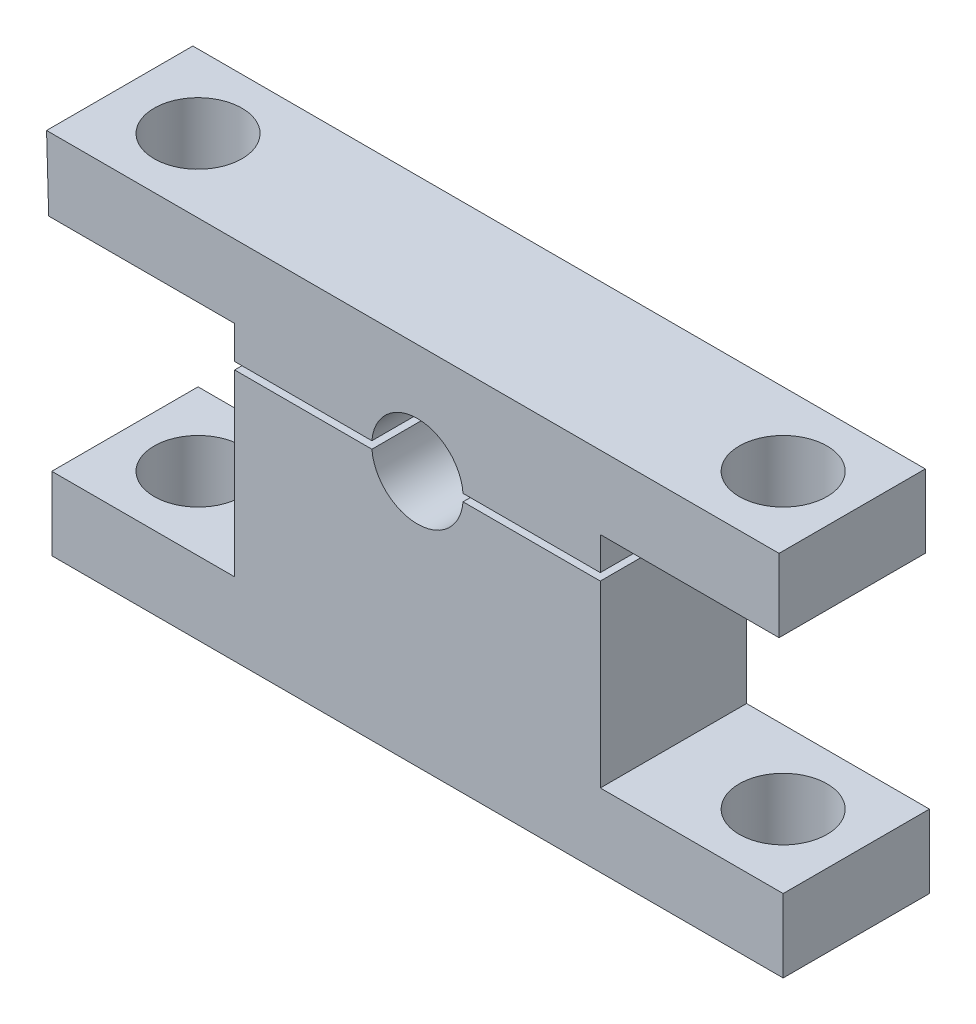
ISO-10303-21;
HEADER;
FILE_DESCRIPTION(('STEP AP214'),'2;1');
FILE_NAME('part.step','',(''),(''),'','','');
FILE_SCHEMA(('AUTOMOTIVE_DESIGN { 1 0 10303 214 1 1 1 1 }'));
ENDSEC;
DATA;
#1=APPLICATION_CONTEXT('core data for automotive mechanical design processes');
#2=APPLICATION_PROTOCOL_DEFINITION('international standard','automotive_design',2000,#1);
#3=PRODUCT_CONTEXT('',#1,'mechanical');
#4=PRODUCT('Part','Part','',(#3));
#5=PRODUCT_RELATED_PRODUCT_CATEGORY('part','',(#4));
#6=PRODUCT_DEFINITION_FORMATION('','',#4);
#7=PRODUCT_DEFINITION_CONTEXT('part definition',#1,'design');
#8=PRODUCT_DEFINITION('design','',#6,#7);
#9=PRODUCT_DEFINITION_SHAPE('','',#8);
#10=(LENGTH_UNIT() NAMED_UNIT(*) SI_UNIT(.MILLI.,.METRE.));
#11=(NAMED_UNIT(*) PLANE_ANGLE_UNIT() SI_UNIT($,.RADIAN.));
#12=(NAMED_UNIT(*) SI_UNIT($,.STERADIAN.) SOLID_ANGLE_UNIT());
#13=UNCERTAINTY_MEASURE_WITH_UNIT(LENGTH_MEASURE(1.E-05),#10,'distance_accuracy_value','');
#14=(GEOMETRIC_REPRESENTATION_CONTEXT(3) GLOBAL_UNCERTAINTY_ASSIGNED_CONTEXT((#13)) GLOBAL_UNIT_ASSIGNED_CONTEXT((#10,
#11,#12)) REPRESENTATION_CONTEXT('',''));
#15=CARTESIAN_POINT('',(0.,0.,0.));
#16=DIRECTION('',(0.,0.,1.));
#17=DIRECTION('',(1.,0.,0.));
#18=AXIS2_PLACEMENT_3D('',#15,#16,#17);
#19=CARTESIAN_POINT('',(-12.7,-3.81,5.08));
#20=DIRECTION('',(0.,1.,0.));
#21=DIRECTION('',(-1.,0.,0.));
#22=AXIS2_PLACEMENT_3D('',#19,#20,#21);
#23=PLANE('',#22);
#24=CARTESIAN_POINT('',(-10.16,-3.81,2.54));
#25=DIRECTION('',(0.,1.,0.));
#26=DIRECTION('',(-1.,0.,0.));
#27=AXIS2_PLACEMENT_3D('',#24,#25,#26);
#28=CIRCLE('',#27,1.524);
#29=CARTESIAN_POINT('',(-10.16,-3.81,4.064));
#30=VERTEX_POINT('',#29);
#31=EDGE_CURVE('E191',#30,#30,#28,.T.);
#32=ORIENTED_EDGE('',*,*,#31,.F.);
#33=EDGE_LOOP('',(#32));
#34=FACE_BOUND('',#33,.T.);
#35=DIRECTION('',(1.,0.,0.));
#36=VECTOR('',#35,1.);
#37=CARTESIAN_POINT('',(-12.7,-3.81,0.));
#38=LINE('',#37,#36);
#39=CARTESIAN_POINT('',(-12.7,-3.81,0.));
#40=VERTEX_POINT('',#39);
#41=CARTESIAN_POINT('',(-6.35,-3.81,0.));
#42=VERTEX_POINT('',#41);
#43=EDGE_CURVE('E12',#40,#42,#38,.T.);
#44=ORIENTED_EDGE('',*,*,#43,.F.);
#45=DIRECTION('',(0.,0.,-1.));
#46=VECTOR('',#45,1.);
#47=CARTESIAN_POINT('',(-12.7,-3.81,5.08));
#48=LINE('',#47,#46);
#49=CARTESIAN_POINT('',(-12.7,-3.81,5.08));
#50=VERTEX_POINT('',#49);
#51=EDGE_CURVE('E111',#50,#40,#48,.T.);
#52=ORIENTED_EDGE('',*,*,#51,.F.);
#53=DIRECTION('',(1.,0.,0.));
#54=VECTOR('',#53,1.);
#55=CARTESIAN_POINT('',(-12.7,-3.81,5.08));
#56=LINE('',#55,#54);
#57=CARTESIAN_POINT('',(-6.35,-3.81,5.08));
#58=VERTEX_POINT('',#57);
#59=EDGE_CURVE('E178',#50,#58,#56,.T.);
#60=ORIENTED_EDGE('',*,*,#59,.T.);
#61=DIRECTION('',(0.,0.,-1.));
#62=VECTOR('',#61,1.);
#63=CARTESIAN_POINT('',(-6.35,-3.81,5.08));
#64=LINE('',#63,#62);
#65=EDGE_CURVE('E104',#58,#42,#64,.T.);
#66=ORIENTED_EDGE('',*,*,#65,.T.);
#67=EDGE_LOOP('',(#44,#52,#60,#66));
#68=FACE_BOUND('',#67,.T.);
#69=ADVANCED_FACE('F51',(#34,#68),#23,.T.);
#70=CARTESIAN_POINT('',(-12.7,-6.35,5.08));
#71=DIRECTION('',(-1.,0.,0.));
#72=DIRECTION('',(0.,0.,1.));
#73=AXIS2_PLACEMENT_3D('',#70,#71,#72);
#74=PLANE('',#73);
#75=DIRECTION('',(0.,1.,0.));
#76=VECTOR('',#75,1.);
#77=CARTESIAN_POINT('',(-12.7,-6.35,0.));
#78=LINE('',#77,#76);
#79=CARTESIAN_POINT('',(-12.7,-6.35,0.));
#80=VERTEX_POINT('',#79);
#81=EDGE_CURVE('E180',#80,#40,#78,.T.);
#82=ORIENTED_EDGE('',*,*,#81,.F.);
#83=DIRECTION('',(0.,0.,-1.));
#84=VECTOR('',#83,1.);
#85=CARTESIAN_POINT('',(-12.7,-6.35,5.08));
#86=LINE('',#85,#84);
#87=CARTESIAN_POINT('',(-12.7,-6.35,5.08));
#88=VERTEX_POINT('',#87);
#89=EDGE_CURVE('E208',#88,#80,#86,.T.);
#90=ORIENTED_EDGE('',*,*,#89,.F.);
#91=DIRECTION('',(0.,1.,0.));
#92=VECTOR('',#91,1.);
#93=CARTESIAN_POINT('',(-12.7,-6.35,5.08));
#94=LINE('',#93,#92);
#95=EDGE_CURVE('E160',#88,#50,#94,.T.);
#96=ORIENTED_EDGE('',*,*,#95,.T.);
#97=ORIENTED_EDGE('',*,*,#51,.T.);
#98=EDGE_LOOP('',(#82,#90,#96,#97));
#99=FACE_BOUND('',#98,.T.);
#100=ADVANCED_FACE('F247',(#99),#74,.T.);
#101=CARTESIAN_POINT('',(-12.7,-6.35,5.08));
#102=DIRECTION('',(0.,1.,0.));
#103=DIRECTION('',(0.,0.,1.));
#104=AXIS2_PLACEMENT_3D('',#101,#102,#103);
#105=PLANE('',#104);
#106=CARTESIAN_POINT('',(-10.16,-6.35,2.54));
#107=DIRECTION('',(0.,1.,0.));
#108=DIRECTION('',(0.,0.,1.));
#109=AXIS2_PLACEMENT_3D('',#106,#107,#108);
#110=CIRCLE('',#109,1.524);
#111=CARTESIAN_POINT('',(-10.16,-6.35,4.064));
#112=VERTEX_POINT('',#111);
#113=EDGE_CURVE('E55',#112,#112,#110,.T.);
#114=ORIENTED_EDGE('',*,*,#113,.T.);
#115=EDGE_LOOP('',(#114));
#116=FACE_BOUND('',#115,.T.);
#117=CARTESIAN_POINT('',(10.16,-6.35,2.54));
#118=DIRECTION('',(0.,1.,0.));
#119=DIRECTION('',(0.,0.,1.));
#120=AXIS2_PLACEMENT_3D('',#117,#118,#119);
#121=CIRCLE('',#120,1.524);
#122=CARTESIAN_POINT('',(10.16,-6.35,4.064));
#123=VERTEX_POINT('',#122);
#124=EDGE_CURVE('E183',#123,#123,#121,.T.);
#125=ORIENTED_EDGE('',*,*,#124,.T.);
#126=EDGE_LOOP('',(#125));
#127=FACE_BOUND('',#126,.T.);
#128=DIRECTION('',(1.,0.,0.));
#129=VECTOR('',#128,1.);
#130=CARTESIAN_POINT('',(-12.7,-6.35,0.));
#131=LINE('',#130,#129);
#132=CARTESIAN_POINT('',(12.7,-6.35,0.));
#133=VERTEX_POINT('',#132);
#134=EDGE_CURVE('E213',#80,#133,#131,.T.);
#135=ORIENTED_EDGE('',*,*,#134,.T.);
#136=DIRECTION('',(0.,0.,-1.));
#137=VECTOR('',#136,1.);
#138=CARTESIAN_POINT('',(12.7,-6.35,5.08));
#139=LINE('',#138,#137);
#140=CARTESIAN_POINT('',(12.7,-6.35,5.08));
#141=VERTEX_POINT('',#140);
#142=EDGE_CURVE('E205',#141,#133,#139,.T.);
#143=ORIENTED_EDGE('',*,*,#142,.F.);
#144=DIRECTION('',(1.,0.,0.));
#145=VECTOR('',#144,1.);
#146=CARTESIAN_POINT('',(-12.7,-6.35,5.08));
#147=LINE('',#146,#145);
#148=EDGE_CURVE('E162',#88,#141,#147,.T.);
#149=ORIENTED_EDGE('',*,*,#148,.F.);
#150=ORIENTED_EDGE('',*,*,#89,.T.);
#151=EDGE_LOOP('',(#135,#143,#149,#150));
#152=FACE_BOUND('',#151,.T.);
#153=ADVANCED_FACE('F245',(#116,#127,#152),#105,.F.);
#154=CARTESIAN_POINT('',(12.7,-6.35,5.08));
#155=DIRECTION('',(-1.,0.,0.));
#156=DIRECTION('',(0.,0.,1.));
#157=AXIS2_PLACEMENT_3D('',#154,#155,#156);
#158=PLANE('',#157);
#159=DIRECTION('',(0.,1.,0.));
#160=VECTOR('',#159,1.);
#161=CARTESIAN_POINT('',(12.7,-6.35,0.));
#162=LINE('',#161,#160);
#163=CARTESIAN_POINT('',(12.7,-3.81,0.));
#164=VERTEX_POINT('',#163);
#165=EDGE_CURVE('E215',#133,#164,#162,.T.);
#166=ORIENTED_EDGE('',*,*,#165,.T.);
#167=DIRECTION('',(0.,0.,-1.));
#168=VECTOR('',#167,1.);
#169=CARTESIAN_POINT('',(12.7,-3.81,5.08));
#170=LINE('',#169,#168);
#171=CARTESIAN_POINT('',(12.7,-3.81,5.08));
#172=VERTEX_POINT('',#171);
#173=EDGE_CURVE('E203',#172,#164,#170,.T.);
#174=ORIENTED_EDGE('',*,*,#173,.F.);
#175=DIRECTION('',(0.,1.,0.));
#176=VECTOR('',#175,1.);
#177=CARTESIAN_POINT('',(12.7,-6.35,5.08));
#178=LINE('',#177,#176);
#179=EDGE_CURVE('E164',#141,#172,#178,.T.);
#180=ORIENTED_EDGE('',*,*,#179,.F.);
#181=ORIENTED_EDGE('',*,*,#142,.T.);
#182=EDGE_LOOP('',(#166,#174,#180,#181));
#183=FACE_BOUND('',#182,.T.);
#184=ADVANCED_FACE('F241',(#183),#158,.F.);
#185=CARTESIAN_POINT('',(6.35,-3.81,5.08));
#186=DIRECTION('',(0.,1.,0.));
#187=DIRECTION('',(-1.,0.,0.));
#188=AXIS2_PLACEMENT_3D('',#185,#186,#187);
#189=PLANE('',#188);
#190=CARTESIAN_POINT('',(10.16,-3.81,2.54));
#191=DIRECTION('',(0.,1.,0.));
#192=DIRECTION('',(-1.,0.,0.));
#193=AXIS2_PLACEMENT_3D('',#190,#191,#192);
#194=CIRCLE('',#193,1.524);
#195=CARTESIAN_POINT('',(10.16,-3.81,4.064));
#196=VERTEX_POINT('',#195);
#197=EDGE_CURVE('E181',#196,#196,#194,.T.);
#198=ORIENTED_EDGE('',*,*,#197,.F.);
#199=EDGE_LOOP('',(#198));
#200=FACE_BOUND('',#199,.T.);
#201=DIRECTION('',(1.,0.,0.));
#202=VECTOR('',#201,1.);
#203=CARTESIAN_POINT('',(6.35,-3.81,0.));
#204=LINE('',#203,#202);
#205=CARTESIAN_POINT('',(6.35,-3.81,0.));
#206=VERTEX_POINT('',#205);
#207=EDGE_CURVE('E218',#206,#164,#204,.T.);
#208=ORIENTED_EDGE('',*,*,#207,.F.);
#209=DIRECTION('',(0.,0.,-1.));
#210=VECTOR('',#209,1.);
#211=CARTESIAN_POINT('',(6.35,-3.81,5.08));
#212=LINE('',#211,#210);
#213=CARTESIAN_POINT('',(6.35,-3.81,5.08));
#214=VERTEX_POINT('',#213);
#215=EDGE_CURVE('E201',#214,#206,#212,.T.);
#216=ORIENTED_EDGE('',*,*,#215,.F.);
#217=DIRECTION('',(1.,0.,0.));
#218=VECTOR('',#217,1.);
#219=CARTESIAN_POINT('',(6.35,-3.81,5.08));
#220=LINE('',#219,#218);
#221=EDGE_CURVE('E166',#214,#172,#220,.T.);
#222=ORIENTED_EDGE('',*,*,#221,.T.);
#223=ORIENTED_EDGE('',*,*,#173,.T.);
#224=EDGE_LOOP('',(#208,#216,#222,#223));
#225=FACE_BOUND('',#224,.T.);
#226=ADVANCED_FACE('F237',(#200,#225),#189,.T.);
#227=CARTESIAN_POINT('',(6.35,-3.81,5.08));
#228=DIRECTION('',(-1.,0.,0.));
#229=DIRECTION('',(0.,-1.,0.));
#230=AXIS2_PLACEMENT_3D('',#227,#228,#229);
#231=PLANE('',#230);
#232=DIRECTION('',(0.,1.,0.));
#233=VECTOR('',#232,1.);
#234=CARTESIAN_POINT('',(6.35,-3.81,0.));
#235=LINE('',#234,#233);
#236=CARTESIAN_POINT('',(6.35,2.413,0.));
#237=VERTEX_POINT('',#236);
#238=EDGE_CURVE('E221',#206,#237,#235,.T.);
#239=ORIENTED_EDGE('',*,*,#238,.T.);
#240=DIRECTION('',(0.,0.,-1.));
#241=VECTOR('',#240,1.);
#242=CARTESIAN_POINT('',(6.35,2.413,5.08));
#243=LINE('',#242,#241);
#244=CARTESIAN_POINT('',(6.35,2.413,5.08));
#245=VERTEX_POINT('',#244);
#246=EDGE_CURVE('E198',#245,#237,#243,.T.);
#247=ORIENTED_EDGE('',*,*,#246,.F.);
#248=DIRECTION('',(0.,-1.,0.));
#249=VECTOR('',#248,1.);
#250=CARTESIAN_POINT('',(6.35,2.413,5.08));
#251=LINE('',#250,#249);
#252=EDGE_CURVE('E169',#245,#214,#251,.T.);
#253=ORIENTED_EDGE('',*,*,#252,.T.);
#254=ORIENTED_EDGE('',*,*,#215,.T.);
#255=EDGE_LOOP('',(#239,#247,#253,#254));
#256=FACE_BOUND('',#255,.T.);
#257=ADVANCED_FACE('F229',(#256),#231,.F.);
#258=CARTESIAN_POINT('',(1.58241184588589,2.413,5.08));
#259=DIRECTION('',(0.,1.,0.));
#260=DIRECTION('',(-1.,0.,0.));
#261=AXIS2_PLACEMENT_3D('',#258,#259,#260);
#262=PLANE('',#261);
#263=DIRECTION('',(1.,0.,0.));
#264=VECTOR('',#263,1.);
#265=CARTESIAN_POINT('',(1.58241184588589,2.413,0.));
#266=LINE('',#265,#264);
#267=CARTESIAN_POINT('',(1.58241184588589,2.413,0.));
#268=VERTEX_POINT('',#267);
#269=EDGE_CURVE('E153',#268,#237,#266,.T.);
#270=ORIENTED_EDGE('',*,*,#269,.F.);
#271=DIRECTION('',(0.,0.,-1.));
#272=VECTOR('',#271,1.);
#273=CARTESIAN_POINT('',(1.58241184588589,2.413,5.08));
#274=LINE('',#273,#272);
#275=CARTESIAN_POINT('',(1.58241184588589,2.413,5.08));
#276=VERTEX_POINT('',#275);
#277=EDGE_CURVE('E145',#276,#268,#274,.T.);
#278=ORIENTED_EDGE('',*,*,#277,.F.);
#279=DIRECTION('',(1.,0.,0.));
#280=VECTOR('',#279,1.);
#281=CARTESIAN_POINT('',(1.58241184588589,2.413,5.08));
#282=LINE('',#281,#280);
#283=EDGE_CURVE('E171',#276,#245,#282,.T.);
#284=ORIENTED_EDGE('',*,*,#283,.T.);
#285=ORIENTED_EDGE('',*,*,#246,.T.);
#286=EDGE_LOOP('',(#270,#278,#284,#285));
#287=FACE_BOUND('',#286,.T.);
#288=ADVANCED_FACE('F225',(#287),#262,.T.);
#289=CARTESIAN_POINT('',(0.,2.54,5.08));
#290=DIRECTION('',(0.,0.,-1.));
#291=DIRECTION('',(-1.,0.,0.));
#292=AXIS2_PLACEMENT_3D('',#289,#290,#291);
#293=CYLINDRICAL_SURFACE('',#292,1.5875);
#294=CARTESIAN_POINT('',(0.,2.54,0.));
#295=DIRECTION('',(0.,0.,1.));
#296=DIRECTION('',(1.,0.,0.));
#297=AXIS2_PLACEMENT_3D('',#294,#295,#296);
#298=CIRCLE('',#297,1.5875);
#299=CARTESIAN_POINT('',(-1.5824118458859,2.413,0.));
#300=VERTEX_POINT('',#299);
#301=EDGE_CURVE('E148',#300,#268,#298,.T.);
#302=ORIENTED_EDGE('',*,*,#301,.F.);
#303=DIRECTION('',(0.,0.,-1.));
#304=VECTOR('',#303,1.);
#305=CARTESIAN_POINT('',(-1.5824118458859,2.413,5.08));
#306=LINE('',#305,#304);
#307=CARTESIAN_POINT('',(-1.5824118458859,2.413,5.08));
#308=VERTEX_POINT('',#307);
#309=EDGE_CURVE('E134',#308,#300,#306,.T.);
#310=ORIENTED_EDGE('',*,*,#309,.F.);
#311=CARTESIAN_POINT('',(0.,2.54,5.08));
#312=DIRECTION('',(0.,0.,1.));
#313=DIRECTION('',(1.,0.,0.));
#314=AXIS2_PLACEMENT_3D('',#311,#312,#313);
#315=CIRCLE('',#314,1.5875);
#316=EDGE_CURVE('E174',#308,#276,#315,.T.);
#317=ORIENTED_EDGE('',*,*,#316,.T.);
#318=ORIENTED_EDGE('',*,*,#277,.T.);
#319=EDGE_LOOP('',(#302,#310,#317,#318));
#320=FACE_BOUND('',#319,.T.);
#321=ADVANCED_FACE('F149',(#320),#293,.F.);
#322=CARTESIAN_POINT('',(-6.35,2.413,5.08));
#323=DIRECTION('',(0.,1.,0.));
#324=DIRECTION('',(0.,0.,1.));
#325=AXIS2_PLACEMENT_3D('',#322,#323,#324);
#326=PLANE('',#325);
#327=DIRECTION('',(1.,0.,0.));
#328=VECTOR('',#327,1.);
#329=CARTESIAN_POINT('',(-6.35,2.413,0.));
#330=LINE('',#329,#328);
#331=CARTESIAN_POINT('',(-6.35,2.413,0.));
#332=VERTEX_POINT('',#331);
#333=EDGE_CURVE('E138',#332,#300,#330,.T.);
#334=ORIENTED_EDGE('',*,*,#333,.F.);
#335=DIRECTION('',(0.,0.,-1.));
#336=VECTOR('',#335,1.);
#337=CARTESIAN_POINT('',(-6.35,2.413,5.08));
#338=LINE('',#337,#336);
#339=CARTESIAN_POINT('',(-6.35,2.413,5.08));
#340=VERTEX_POINT('',#339);
#341=EDGE_CURVE('E144',#340,#332,#338,.T.);
#342=ORIENTED_EDGE('',*,*,#341,.F.);
#343=DIRECTION('',(1.,0.,0.));
#344=VECTOR('',#343,1.);
#345=CARTESIAN_POINT('',(-6.35,2.413,5.08));
#346=LINE('',#345,#344);
#347=EDGE_CURVE('E140',#340,#308,#346,.T.);
#348=ORIENTED_EDGE('',*,*,#347,.T.);
#349=ORIENTED_EDGE('',*,*,#309,.T.);
#350=EDGE_LOOP('',(#334,#342,#348,#349));
#351=FACE_BOUND('',#350,.T.);
#352=ADVANCED_FACE('F136',(#351),#326,.T.);
#353=CARTESIAN_POINT('',(-6.35,2.413,5.08));
#354=DIRECTION('',(1.,0.,0.));
#355=DIRECTION('',(0.,1.,0.));
#356=AXIS2_PLACEMENT_3D('',#353,#354,#355);
#357=PLANE('',#356);
#358=DIRECTION('',(0.,-1.,0.));
#359=VECTOR('',#358,1.);
#360=CARTESIAN_POINT('',(-6.35,2.413,0.));
#361=LINE('',#360,#359);
#362=EDGE_CURVE('E61',#332,#42,#361,.T.);
#363=ORIENTED_EDGE('',*,*,#362,.T.);
#364=ORIENTED_EDGE('',*,*,#65,.F.);
#365=DIRECTION('',(0.,1.,0.));
#366=VECTOR('',#365,1.);
#367=CARTESIAN_POINT('',(-6.35,-3.81,5.08));
#368=LINE('',#367,#366);
#369=EDGE_CURVE('E101',#58,#340,#368,.T.);
#370=ORIENTED_EDGE('',*,*,#369,.T.);
#371=ORIENTED_EDGE('',*,*,#341,.T.);
#372=EDGE_LOOP('',(#363,#364,#370,#371));
#373=FACE_BOUND('',#372,.T.);
#374=ADVANCED_FACE('F263',(#373),#357,.F.);
#375=CARTESIAN_POINT('',(0.,2.54,5.08));
#376=DIRECTION('',(0.,0.,1.));
#377=DIRECTION('',(1.,0.,0.));
#378=AXIS2_PLACEMENT_3D('',#375,#376,#377);
#379=PLANE('',#378);
#380=ORIENTED_EDGE('',*,*,#59,.F.);
#381=ORIENTED_EDGE('',*,*,#95,.F.);
#382=ORIENTED_EDGE('',*,*,#148,.T.);
#383=ORIENTED_EDGE('',*,*,#179,.T.);
#384=ORIENTED_EDGE('',*,*,#221,.F.);
#385=ORIENTED_EDGE('',*,*,#252,.F.);
#386=ORIENTED_EDGE('',*,*,#283,.F.);
#387=ORIENTED_EDGE('',*,*,#316,.F.);
#388=ORIENTED_EDGE('',*,*,#347,.F.);
#389=ORIENTED_EDGE('',*,*,#369,.F.);
#390=EDGE_LOOP('',(#380,#381,#382,#383,#384,#385,#386,#387,#388,#389));
#391=FACE_BOUND('',#390,.T.);
#392=ADVANCED_FACE('F53',(#391),#379,.T.);
#393=CARTESIAN_POINT('',(0.,2.54,0.));
#394=DIRECTION('',(0.,0.,1.));
#395=DIRECTION('',(1.,0.,0.));
#396=AXIS2_PLACEMENT_3D('',#393,#394,#395);
#397=PLANE('',#396);
#398=ORIENTED_EDGE('',*,*,#43,.T.);
#399=ORIENTED_EDGE('',*,*,#362,.F.);
#400=ORIENTED_EDGE('',*,*,#333,.T.);
#401=ORIENTED_EDGE('',*,*,#301,.T.);
#402=ORIENTED_EDGE('',*,*,#269,.T.);
#403=ORIENTED_EDGE('',*,*,#238,.F.);
#404=ORIENTED_EDGE('',*,*,#207,.T.);
#405=ORIENTED_EDGE('',*,*,#165,.F.);
#406=ORIENTED_EDGE('',*,*,#134,.F.);
#407=ORIENTED_EDGE('',*,*,#81,.T.);
#408=EDGE_LOOP('',(#398,#399,#400,#401,#402,#403,#404,#405,#406,#407));
#409=FACE_BOUND('',#408,.T.);
#410=ADVANCED_FACE('F155',(#409),#397,.F.);
#411=CARTESIAN_POINT('',(10.16,-6.350012,2.54));
#412=DIRECTION('',(0.,1.,0.));
#413=DIRECTION('',(0.,0.,1.));
#414=AXIS2_PLACEMENT_3D('',#411,#412,#413);
#415=CYLINDRICAL_SURFACE('',#414,1.524);
#416=CARTESIAN_POINT('',(10.16,-3.81,4.064));
#417=CARTESIAN_POINT('',(10.16,-3.83645833333333,4.064));
#418=CARTESIAN_POINT('',(10.16,-3.86291666666667,4.064));
#419=CARTESIAN_POINT('',(10.16,-3.91583333333333,4.064));
#420=CARTESIAN_POINT('',(10.16,-3.94229166666667,4.064));
#421=CARTESIAN_POINT('',(10.16,-3.99520833333333,4.064));
#422=CARTESIAN_POINT('',(10.16,-4.02166666666667,4.064));
#423=CARTESIAN_POINT('',(10.16,-4.07458333333333,4.064));
#424=CARTESIAN_POINT('',(10.16,-4.10104166666667,4.064));
#425=CARTESIAN_POINT('',(10.16,-4.15395833333333,4.064));
#426=CARTESIAN_POINT('',(10.16,-4.18041666666667,4.064));
#427=CARTESIAN_POINT('',(10.16,-4.23333333333333,4.064));
#428=CARTESIAN_POINT('',(10.16,-4.25979166666667,4.064));
#429=CARTESIAN_POINT('',(10.16,-4.31270833333333,4.064));
#430=CARTESIAN_POINT('',(10.16,-4.33916666666667,4.064));
#431=CARTESIAN_POINT('',(10.16,-4.39208333333333,4.064));
#432=CARTESIAN_POINT('',(10.16,-4.41854166666667,4.064));
#433=CARTESIAN_POINT('',(10.16,-4.47145833333333,4.064));
#434=CARTESIAN_POINT('',(10.16,-4.49791666666667,4.064));
#435=CARTESIAN_POINT('',(10.16,-4.55083333333333,4.064));
#436=CARTESIAN_POINT('',(10.16,-4.57729166666667,4.064));
#437=CARTESIAN_POINT('',(10.16,-4.63020833333333,4.064));
#438=CARTESIAN_POINT('',(10.16,-4.65666666666667,4.064));
#439=CARTESIAN_POINT('',(10.16,-4.70958333333333,4.064));
#440=CARTESIAN_POINT('',(10.16,-4.73604166666667,4.064));
#441=CARTESIAN_POINT('',(10.16,-4.78895833333333,4.064));
#442=CARTESIAN_POINT('',(10.16,-4.81541666666667,4.064));
#443=CARTESIAN_POINT('',(10.16,-4.86833333333333,4.064));
#444=CARTESIAN_POINT('',(10.16,-4.89479166666667,4.064));
#445=CARTESIAN_POINT('',(10.16,-4.94770833333333,4.064));
#446=CARTESIAN_POINT('',(10.16,-4.97416666666667,4.064));
#447=CARTESIAN_POINT('',(10.16,-5.02708333333333,4.064));
#448=CARTESIAN_POINT('',(10.16,-5.05354166666667,4.064));
#449=CARTESIAN_POINT('',(10.16,-5.10645833333333,4.064));
#450=CARTESIAN_POINT('',(10.16,-5.13291666666667,4.064));
#451=CARTESIAN_POINT('',(10.16,-5.18583333333333,4.064));
#452=CARTESIAN_POINT('',(10.16,-5.21229166666667,4.064));
#453=CARTESIAN_POINT('',(10.16,-5.26520833333333,4.064));
#454=CARTESIAN_POINT('',(10.16,-5.29166666666667,4.064));
#455=CARTESIAN_POINT('',(10.16,-5.34458333333333,4.064));
#456=CARTESIAN_POINT('',(10.16,-5.37104166666667,4.064));
#457=CARTESIAN_POINT('',(10.16,-5.42395833333333,4.064));
#458=CARTESIAN_POINT('',(10.16,-5.45041666666667,4.064));
#459=CARTESIAN_POINT('',(10.16,-5.50333333333333,4.064));
#460=CARTESIAN_POINT('',(10.16,-5.52979166666667,4.064));
#461=CARTESIAN_POINT('',(10.16,-5.58270833333333,4.064));
#462=CARTESIAN_POINT('',(10.16,-5.60916666666667,4.064));
#463=CARTESIAN_POINT('',(10.16,-5.66208333333333,4.064));
#464=CARTESIAN_POINT('',(10.16,-5.68854166666667,4.064));
#465=CARTESIAN_POINT('',(10.16,-5.74145833333333,4.064));
#466=CARTESIAN_POINT('',(10.16,-5.76791666666667,4.064));
#467=CARTESIAN_POINT('',(10.16,-5.82083333333333,4.064));
#468=CARTESIAN_POINT('',(10.16,-5.84729166666667,4.064));
#469=CARTESIAN_POINT('',(10.16,-5.90020833333333,4.064));
#470=CARTESIAN_POINT('',(10.16,-5.92666666666667,4.064));
#471=CARTESIAN_POINT('',(10.16,-5.97958333333333,4.064));
#472=CARTESIAN_POINT('',(10.16,-6.00604166666667,4.064));
#473=CARTESIAN_POINT('',(10.16,-6.05895833333333,4.064));
#474=CARTESIAN_POINT('',(10.16,-6.08541666666667,4.064));
#475=CARTESIAN_POINT('',(10.16,-6.13833333333333,4.064));
#476=CARTESIAN_POINT('',(10.16,-6.16479166666667,4.064));
#477=CARTESIAN_POINT('',(10.16,-6.21770833333333,4.064));
#478=CARTESIAN_POINT('',(10.16,-6.24416666666667,4.064));
#479=CARTESIAN_POINT('',(10.16,-6.29708333333333,4.064));
#480=CARTESIAN_POINT('',(10.16,-6.32354166666667,4.064));
#481=CARTESIAN_POINT('',(10.16,-6.35,4.064));
#482=B_SPLINE_CURVE_WITH_KNOTS('',3,(#416,#417,#418,#419,#420,#421,#422,#423,#424,#425,#426,
#427,#428,#429,#430,#431,#432,#433,#434,#435,#436,#437,#438,#439,#440,#441,#442,#443,#444,#445,
#446,#447,#448,#449,#450,#451,#452,#453,#454,#455,#456,#457,#458,#459,#460,#461,#462,#463,#464,
#465,#466,#467,#468,#469,#470,#471,#472,#473,#474,#475,#476,#477,#478,#479,#480,#481),
.UNSPECIFIED.,.F.,.F.,(4,2,2,2,2,2,2,2,2,2,2,2,2,2,2,2,2,2,2,2,2,2,2,2,2,2,2,2,2,2,2,2,4),(0.,
0.079375,0.15875,0.238125,0.317500000000001,0.396875,0.47625,0.555625,0.635,0.714375,0.79375,
0.873125,0.952500000000001,1.031875,1.11125,1.190625,1.27,1.349375,1.42875,1.508125,1.5875,
1.666875,1.74625,1.825625,1.905,1.984375,2.06375,2.143125,2.2225,2.301875,2.38125,2.460625,
2.54),.UNSPECIFIED.);
#483=EDGE_CURVE('BSEAM261',#196,#123,#482,.T.);
#484=ORIENTED_EDGE('',*,*,#197,.T.);
#485=ORIENTED_EDGE('',*,*,#124,.F.);
#486=ORIENTED_EDGE('',*,*,#483,.T.);
#487=ORIENTED_EDGE('',*,*,#483,.F.);
#488=EDGE_LOOP('',(#484,#486,#485,#487));
#489=FACE_BOUND('',#488,.T.);
#490=ADVANCED_FACE('F261',(#489),#415,.F.);
#491=CARTESIAN_POINT('',(-10.16,-6.350012,2.54));
#492=DIRECTION('',(0.,1.,0.));
#493=DIRECTION('',(0.,0.,1.));
#494=AXIS2_PLACEMENT_3D('',#491,#492,#493);
#495=CYLINDRICAL_SURFACE('',#494,1.524);
#496=CARTESIAN_POINT('',(-10.16,-3.81,4.064));
#497=CARTESIAN_POINT('',(-10.16,-3.83645833333333,4.064));
#498=CARTESIAN_POINT('',(-10.16,-3.86291666666667,4.064));
#499=CARTESIAN_POINT('',(-10.16,-3.91583333333333,4.064));
#500=CARTESIAN_POINT('',(-10.16,-3.94229166666667,4.064));
#501=CARTESIAN_POINT('',(-10.16,-3.99520833333333,4.064));
#502=CARTESIAN_POINT('',(-10.16,-4.02166666666667,4.064));
#503=CARTESIAN_POINT('',(-10.16,-4.07458333333333,4.064));
#504=CARTESIAN_POINT('',(-10.16,-4.10104166666667,4.064));
#505=CARTESIAN_POINT('',(-10.16,-4.15395833333333,4.064));
#506=CARTESIAN_POINT('',(-10.16,-4.18041666666667,4.064));
#507=CARTESIAN_POINT('',(-10.16,-4.23333333333333,4.064));
#508=CARTESIAN_POINT('',(-10.16,-4.25979166666667,4.064));
#509=CARTESIAN_POINT('',(-10.16,-4.31270833333333,4.064));
#510=CARTESIAN_POINT('',(-10.16,-4.33916666666667,4.064));
#511=CARTESIAN_POINT('',(-10.16,-4.39208333333333,4.064));
#512=CARTESIAN_POINT('',(-10.16,-4.41854166666667,4.064));
#513=CARTESIAN_POINT('',(-10.16,-4.47145833333333,4.064));
#514=CARTESIAN_POINT('',(-10.16,-4.49791666666667,4.064));
#515=CARTESIAN_POINT('',(-10.16,-4.55083333333333,4.064));
#516=CARTESIAN_POINT('',(-10.16,-4.57729166666667,4.064));
#517=CARTESIAN_POINT('',(-10.16,-4.63020833333333,4.064));
#518=CARTESIAN_POINT('',(-10.16,-4.65666666666667,4.064));
#519=CARTESIAN_POINT('',(-10.16,-4.70958333333333,4.064));
#520=CARTESIAN_POINT('',(-10.16,-4.73604166666667,4.064));
#521=CARTESIAN_POINT('',(-10.16,-4.78895833333333,4.064));
#522=CARTESIAN_POINT('',(-10.16,-4.81541666666667,4.064));
#523=CARTESIAN_POINT('',(-10.16,-4.86833333333333,4.064));
#524=CARTESIAN_POINT('',(-10.16,-4.89479166666667,4.064));
#525=CARTESIAN_POINT('',(-10.16,-4.94770833333333,4.064));
#526=CARTESIAN_POINT('',(-10.16,-4.97416666666667,4.064));
#527=CARTESIAN_POINT('',(-10.16,-5.02708333333333,4.064));
#528=CARTESIAN_POINT('',(-10.16,-5.05354166666667,4.064));
#529=CARTESIAN_POINT('',(-10.16,-5.10645833333333,4.064));
#530=CARTESIAN_POINT('',(-10.16,-5.13291666666667,4.064));
#531=CARTESIAN_POINT('',(-10.16,-5.18583333333333,4.064));
#532=CARTESIAN_POINT('',(-10.16,-5.21229166666667,4.064));
#533=CARTESIAN_POINT('',(-10.16,-5.26520833333333,4.064));
#534=CARTESIAN_POINT('',(-10.16,-5.29166666666667,4.064));
#535=CARTESIAN_POINT('',(-10.16,-5.34458333333333,4.064));
#536=CARTESIAN_POINT('',(-10.16,-5.37104166666667,4.064));
#537=CARTESIAN_POINT('',(-10.16,-5.42395833333333,4.064));
#538=CARTESIAN_POINT('',(-10.16,-5.45041666666667,4.064));
#539=CARTESIAN_POINT('',(-10.16,-5.50333333333333,4.064));
#540=CARTESIAN_POINT('',(-10.16,-5.52979166666667,4.064));
#541=CARTESIAN_POINT('',(-10.16,-5.58270833333333,4.064));
#542=CARTESIAN_POINT('',(-10.16,-5.60916666666667,4.064));
#543=CARTESIAN_POINT('',(-10.16,-5.66208333333333,4.064));
#544=CARTESIAN_POINT('',(-10.16,-5.68854166666667,4.064));
#545=CARTESIAN_POINT('',(-10.16,-5.74145833333333,4.064));
#546=CARTESIAN_POINT('',(-10.16,-5.76791666666667,4.064));
#547=CARTESIAN_POINT('',(-10.16,-5.82083333333333,4.064));
#548=CARTESIAN_POINT('',(-10.16,-5.84729166666667,4.064));
#549=CARTESIAN_POINT('',(-10.16,-5.90020833333333,4.064));
#550=CARTESIAN_POINT('',(-10.16,-5.92666666666667,4.064));
#551=CARTESIAN_POINT('',(-10.16,-5.97958333333333,4.064));
#552=CARTESIAN_POINT('',(-10.16,-6.00604166666667,4.064));
#553=CARTESIAN_POINT('',(-10.16,-6.05895833333333,4.064));
#554=CARTESIAN_POINT('',(-10.16,-6.08541666666667,4.064));
#555=CARTESIAN_POINT('',(-10.16,-6.13833333333333,4.064));
#556=CARTESIAN_POINT('',(-10.16,-6.16479166666667,4.064));
#557=CARTESIAN_POINT('',(-10.16,-6.21770833333333,4.064));
#558=CARTESIAN_POINT('',(-10.16,-6.24416666666667,4.064));
#559=CARTESIAN_POINT('',(-10.16,-6.29708333333333,4.064));
#560=CARTESIAN_POINT('',(-10.16,-6.32354166666667,4.064));
#561=CARTESIAN_POINT('',(-10.16,-6.35,4.064));
#562=B_SPLINE_CURVE_WITH_KNOTS('',3,(#496,#497,#498,#499,#500,#501,#502,#503,#504,#505,#506,
#507,#508,#509,#510,#511,#512,#513,#514,#515,#516,#517,#518,#519,#520,#521,#522,#523,#524,#525,
#526,#527,#528,#529,#530,#531,#532,#533,#534,#535,#536,#537,#538,#539,#540,#541,#542,#543,#544,
#545,#546,#547,#548,#549,#550,#551,#552,#553,#554,#555,#556,#557,#558,#559,#560,#561),
.UNSPECIFIED.,.F.,.F.,(4,2,2,2,2,2,2,2,2,2,2,2,2,2,2,2,2,2,2,2,2,2,2,2,2,2,2,2,2,2,2,2,4),(0.,
0.079375,0.15875,0.238125,0.317500000000001,0.396875,0.47625,0.555625,0.635,0.714375,0.79375,
0.873125,0.952500000000001,1.031875,1.11125,1.190625,1.27,1.349375,1.42875,1.508125,1.5875,
1.666875,1.74625,1.825625,1.905,1.984375,2.06375,2.143125,2.2225,2.301875,2.38125,2.460625,
2.54),.UNSPECIFIED.);
#563=EDGE_CURVE('BSEAM284',#30,#112,#562,.T.);
#564=ORIENTED_EDGE('',*,*,#31,.T.);
#565=ORIENTED_EDGE('',*,*,#113,.F.);
#566=ORIENTED_EDGE('',*,*,#563,.T.);
#567=ORIENTED_EDGE('',*,*,#563,.F.);
#568=EDGE_LOOP('',(#564,#566,#565,#567));
#569=FACE_BOUND('',#568,.T.);
#570=ADVANCED_FACE('F284',(#569),#495,.F.);
#571=CLOSED_SHELL('',(#69,#100,#153,#184,#226,#257,#288,#321,#352,#374,#392,#410,#490,#570));
#572=MANIFOLD_SOLID_BREP('B2',#571);
#573=CARTESIAN_POINT('',(-12.8806977295314,6.3499999999978,5.08));
#574=DIRECTION('',(0.999578109145686,0.0290448569756493,0.));
#575=DIRECTION('',(-0.0290448569756493,0.999578109145686,0.));
#576=AXIS2_PLACEMENT_3D('',#573,#574,#575);
#577=PLANE('',#576);
#578=DIRECTION('',(0.0290448569756493,-0.999578109145686,0.));
#579=VECTOR('',#578,1.);
#580=CARTESIAN_POINT('',(-12.8806977295314,6.3499999999978,0.));
#581=LINE('',#580,#579);
#582=CARTESIAN_POINT('',(-12.8806977295314,6.3499999999978,0.));
#583=VERTEX_POINT('',#582);
#584=CARTESIAN_POINT('',(-12.8069362183654,3.81149922786887,0.));
#585=VERTEX_POINT('',#584);
#586=EDGE_CURVE('E487',#583,#585,#581,.T.);
#587=ORIENTED_EDGE('',*,*,#586,.T.);
#588=DIRECTION('',(0.,0.,-1.));
#589=VECTOR('',#588,1.);
#590=CARTESIAN_POINT('',(-12.8069362183654,3.81149922786887,5.08));
#591=LINE('',#590,#589);
#592=CARTESIAN_POINT('',(-12.8069362183654,3.81149922786887,5.08));
#593=VERTEX_POINT('',#592);
#594=EDGE_CURVE('E49',#593,#585,#591,.T.);
#595=ORIENTED_EDGE('',*,*,#594,.F.);
#596=DIRECTION('',(0.0290448569756493,-0.999578109145686,0.));
#597=VECTOR('',#596,1.);
#598=CARTESIAN_POINT('',(-12.8806977295314,6.3499999999978,5.08));
#599=LINE('',#598,#597);
#600=CARTESIAN_POINT('',(-12.8806977295314,6.3499999999978,5.08));
#601=VERTEX_POINT('',#600);
#602=EDGE_CURVE('E512',#601,#593,#599,.T.);
#603=ORIENTED_EDGE('',*,*,#602,.F.);
#604=DIRECTION('',(0.,0.,-1.));
#605=VECTOR('',#604,1.);
#606=CARTESIAN_POINT('',(-12.8806977295314,6.3499999999978,5.08));
#607=LINE('',#606,#605);
#608=EDGE_CURVE('E395',#601,#583,#607,.T.);
#609=ORIENTED_EDGE('',*,*,#608,.T.);
#610=EDGE_LOOP('',(#587,#595,#603,#609));
#611=FACE_BOUND('',#610,.T.);
#612=ADVANCED_FACE('F379',(#611),#577,.F.);
#613=CARTESIAN_POINT('',(-12.8069362183654,3.81149922786887,5.08));
#614=DIRECTION('',(0.,1.,0.));
#615=DIRECTION('',(0.,0.,1.));
#616=AXIS2_PLACEMENT_3D('',#613,#614,#615);
#617=PLANE('',#616);
#618=CARTESIAN_POINT('',(-10.16,3.81149922786887,2.54));
#619=DIRECTION('',(0.,1.,0.));
#620=DIRECTION('',(0.,0.,1.));
#621=AXIS2_PLACEMENT_3D('',#618,#619,#620);
#622=CIRCLE('',#621,1.524);
#623=CARTESIAN_POINT('',(-10.16,3.81149922786887,4.064));
#624=VERTEX_POINT('',#623);
#625=EDGE_CURVE('E581',#624,#624,#622,.T.);
#626=ORIENTED_EDGE('',*,*,#625,.T.);
#627=EDGE_LOOP('',(#626));
#628=FACE_BOUND('',#627,.T.);
#629=DIRECTION('',(1.,0.,0.));
#630=VECTOR('',#629,1.);
#631=CARTESIAN_POINT('',(-12.8069362183654,3.81149922786887,0.));
#632=LINE('',#631,#630);
#633=CARTESIAN_POINT('',(-6.35,3.81149922786887,0.));
#634=VERTEX_POINT('',#633);
#635=EDGE_CURVE('E489',#585,#634,#632,.T.);
#636=ORIENTED_EDGE('',*,*,#635,.T.);
#637=DIRECTION('',(0.,0.,-1.));
#638=VECTOR('',#637,1.);
#639=CARTESIAN_POINT('',(-6.35,3.81149922786887,5.08));
#640=LINE('',#639,#638);
#641=CARTESIAN_POINT('',(-6.35,3.81149922786887,5.08));
#642=VERTEX_POINT('',#641);
#643=EDGE_CURVE('E387',#642,#634,#640,.T.);
#644=ORIENTED_EDGE('',*,*,#643,.F.);
#645=DIRECTION('',(1.,0.,0.));
#646=VECTOR('',#645,1.);
#647=CARTESIAN_POINT('',(-12.8069362183654,3.81149922786887,5.08));
#648=LINE('',#647,#646);
#649=EDGE_CURVE('E439',#593,#642,#648,.T.);
#650=ORIENTED_EDGE('',*,*,#649,.F.);
#651=ORIENTED_EDGE('',*,*,#594,.T.);
#652=EDGE_LOOP('',(#636,#644,#650,#651));
#653=FACE_BOUND('',#652,.T.);
#654=ADVANCED_FACE('F570',(#628,#653),#617,.F.);
#655=CARTESIAN_POINT('',(-6.35,3.81149922786887,5.08));
#656=DIRECTION('',(1.,0.,0.));
#657=DIRECTION('',(0.,0.,-1.));
#658=AXIS2_PLACEMENT_3D('',#655,#656,#657);
#659=PLANE('',#658);
#660=DIRECTION('',(0.,-1.,0.));
#661=VECTOR('',#660,1.);
#662=CARTESIAN_POINT('',(-6.35,3.81149922786887,0.));
#663=LINE('',#662,#661);
#664=CARTESIAN_POINT('',(-6.35,2.667,0.));
#665=VERTEX_POINT('',#664);
#666=EDGE_CURVE('E492',#634,#665,#663,.T.);
#667=ORIENTED_EDGE('',*,*,#666,.T.);
#668=DIRECTION('',(0.,0.,-1.));
#669=VECTOR('',#668,1.);
#670=CARTESIAN_POINT('',(-6.35,2.667,5.08));
#671=LINE('',#670,#669);
#672=CARTESIAN_POINT('',(-6.35,2.667,5.08));
#673=VERTEX_POINT('',#672);
#674=EDGE_CURVE('E522',#673,#665,#671,.T.);
#675=ORIENTED_EDGE('',*,*,#674,.F.);
#676=DIRECTION('',(0.,-1.,0.));
#677=VECTOR('',#676,1.);
#678=CARTESIAN_POINT('',(-6.35,3.81149922786887,5.08));
#679=LINE('',#678,#677);
#680=EDGE_CURVE('E530',#642,#673,#679,.T.);
#681=ORIENTED_EDGE('',*,*,#680,.F.);
#682=ORIENTED_EDGE('',*,*,#643,.T.);
#683=EDGE_LOOP('',(#667,#675,#681,#682));
#684=FACE_BOUND('',#683,.T.);
#685=ADVANCED_FACE('F528',(#684),#659,.F.);
#686=CARTESIAN_POINT('',(-6.35,2.667,5.08));
#687=DIRECTION('',(0.,1.,0.));
#688=DIRECTION('',(0.,0.,1.));
#689=AXIS2_PLACEMENT_3D('',#686,#687,#688);
#690=PLANE('',#689);
#691=DIRECTION('',(1.,0.,0.));
#692=VECTOR('',#691,1.);
#693=CARTESIAN_POINT('',(-6.35,2.667,0.));
#694=LINE('',#693,#692);
#695=CARTESIAN_POINT('',(-1.5824118458859,2.667,0.));
#696=VERTEX_POINT('',#695);
#697=EDGE_CURVE('E494',#665,#696,#694,.T.);
#698=ORIENTED_EDGE('',*,*,#697,.T.);
#699=DIRECTION('',(0.,0.,-1.));
#700=VECTOR('',#699,1.);
#701=CARTESIAN_POINT('',(-1.5824118458859,2.667,5.08));
#702=LINE('',#701,#700);
#703=CARTESIAN_POINT('',(-1.5824118458859,2.667,5.08));
#704=VERTEX_POINT('',#703);
#705=EDGE_CURVE('E520',#704,#696,#702,.T.);
#706=ORIENTED_EDGE('',*,*,#705,.F.);
#707=DIRECTION('',(1.,0.,0.));
#708=VECTOR('',#707,1.);
#709=CARTESIAN_POINT('',(-6.35,2.667,5.08));
#710=LINE('',#709,#708);
#711=EDGE_CURVE('E541',#673,#704,#710,.T.);
#712=ORIENTED_EDGE('',*,*,#711,.F.);
#713=ORIENTED_EDGE('',*,*,#674,.T.);
#714=EDGE_LOOP('',(#698,#706,#712,#713));
#715=FACE_BOUND('',#714,.T.);
#716=ADVANCED_FACE('F538',(#715),#690,.F.);
#717=CARTESIAN_POINT('',(0.,2.54,5.08));
#718=DIRECTION('',(0.,0.,-1.));
#719=DIRECTION('',(-1.,0.,0.));
#720=AXIS2_PLACEMENT_3D('',#717,#718,#719);
#721=CYLINDRICAL_SURFACE('',#720,1.5875);
#722=CARTESIAN_POINT('',(0.,2.54,0.));
#723=DIRECTION('',(0.,0.,1.));
#724=DIRECTION('',(1.,0.,0.));
#725=AXIS2_PLACEMENT_3D('',#722,#723,#724);
#726=CIRCLE('',#725,1.5875);
#727=CARTESIAN_POINT('',(1.58241184588589,2.667,0.));
#728=VERTEX_POINT('',#727);
#729=EDGE_CURVE('E497',#728,#696,#726,.T.);
#730=ORIENTED_EDGE('',*,*,#729,.F.);
#731=DIRECTION('',(0.,0.,-1.));
#732=VECTOR('',#731,1.);
#733=CARTESIAN_POINT('',(1.58241184588589,2.667,5.08));
#734=LINE('',#733,#732);
#735=CARTESIAN_POINT('',(1.58241184588589,2.667,5.08));
#736=VERTEX_POINT('',#735);
#737=EDGE_CURVE('E518',#736,#728,#734,.T.);
#738=ORIENTED_EDGE('',*,*,#737,.F.);
#739=CARTESIAN_POINT('',(0.,2.54,5.08));
#740=DIRECTION('',(0.,0.,1.));
#741=DIRECTION('',(1.,0.,0.));
#742=AXIS2_PLACEMENT_3D('',#739,#740,#741);
#743=CIRCLE('',#742,1.5875);
#744=EDGE_CURVE('E543',#736,#704,#743,.T.);
#745=ORIENTED_EDGE('',*,*,#744,.T.);
#746=ORIENTED_EDGE('',*,*,#705,.T.);
#747=EDGE_LOOP('',(#730,#738,#745,#746));
#748=FACE_BOUND('',#747,.T.);
#749=ADVANCED_FACE('F606',(#748),#721,.F.);
#750=CARTESIAN_POINT('',(1.58241184588589,2.667,5.08));
#751=DIRECTION('',(0.,1.,0.));
#752=DIRECTION('',(-1.,0.,0.));
#753=AXIS2_PLACEMENT_3D('',#750,#751,#752);
#754=PLANE('',#753);
#755=DIRECTION('',(1.,0.,0.));
#756=VECTOR('',#755,1.);
#757=CARTESIAN_POINT('',(1.58241184588589,2.667,0.));
#758=LINE('',#757,#756);
#759=CARTESIAN_POINT('',(6.35,2.667,0.));
#760=VERTEX_POINT('',#759);
#761=EDGE_CURVE('E500',#728,#760,#758,.T.);
#762=ORIENTED_EDGE('',*,*,#761,.T.);
#763=DIRECTION('',(0.,0.,-1.));
#764=VECTOR('',#763,1.);
#765=CARTESIAN_POINT('',(6.35,2.667,5.08));
#766=LINE('',#765,#764);
#767=CARTESIAN_POINT('',(6.35,2.667,5.08));
#768=VERTEX_POINT('',#767);
#769=EDGE_CURVE('E516',#768,#760,#766,.T.);
#770=ORIENTED_EDGE('',*,*,#769,.F.);
#771=DIRECTION('',(1.,0.,0.));
#772=VECTOR('',#771,1.);
#773=CARTESIAN_POINT('',(1.58241184588589,2.667,5.08));
#774=LINE('',#773,#772);
#775=EDGE_CURVE('E545',#736,#768,#774,.T.);
#776=ORIENTED_EDGE('',*,*,#775,.F.);
#777=ORIENTED_EDGE('',*,*,#737,.T.);
#778=EDGE_LOOP('',(#762,#770,#776,#777));
#779=FACE_BOUND('',#778,.T.);
#780=ADVANCED_FACE('F601',(#779),#754,.F.);
#781=CARTESIAN_POINT('',(6.35,3.81268047838214,5.08));
#782=DIRECTION('',(1.,0.,0.));
#783=DIRECTION('',(0.,1.,0.));
#784=AXIS2_PLACEMENT_3D('',#781,#782,#783);
#785=PLANE('',#784);
#786=DIRECTION('',(0.,-1.,0.));
#787=VECTOR('',#786,1.);
#788=CARTESIAN_POINT('',(6.35,3.81268047838214,0.));
#789=LINE('',#788,#787);
#790=CARTESIAN_POINT('',(6.35,3.81268047838214,0.));
#791=VERTEX_POINT('',#790);
#792=EDGE_CURVE('E503',#791,#760,#789,.T.);
#793=ORIENTED_EDGE('',*,*,#792,.F.);
#794=DIRECTION('',(0.,0.,-1.));
#795=VECTOR('',#794,1.);
#796=CARTESIAN_POINT('',(6.35,3.81268047838214,5.08));
#797=LINE('',#796,#795);
#798=CARTESIAN_POINT('',(6.35,3.81268047838214,5.08));
#799=VERTEX_POINT('',#798);
#800=EDGE_CURVE('E479',#799,#791,#797,.T.);
#801=ORIENTED_EDGE('',*,*,#800,.F.);
#802=DIRECTION('',(0.,-1.,0.));
#803=VECTOR('',#802,1.);
#804=CARTESIAN_POINT('',(6.35,3.81268047838214,5.08));
#805=LINE('',#804,#803);
#806=EDGE_CURVE('E469',#799,#768,#805,.T.);
#807=ORIENTED_EDGE('',*,*,#806,.T.);
#808=ORIENTED_EDGE('',*,*,#769,.T.);
#809=EDGE_LOOP('',(#793,#801,#807,#808));
#810=FACE_BOUND('',#809,.T.);
#811=ADVANCED_FACE('F552',(#810),#785,.T.);
#812=CARTESIAN_POINT('',(6.35,3.81268047838214,5.08));
#813=DIRECTION('',(0.,1.,0.));
#814=DIRECTION('',(0.,0.,1.));
#815=AXIS2_PLACEMENT_3D('',#812,#813,#814);
#816=PLANE('',#815);
#817=CARTESIAN_POINT('',(10.16,3.81268047838214,2.54));
#818=DIRECTION('',(0.,1.,0.));
#819=DIRECTION('',(0.,0.,1.));
#820=AXIS2_PLACEMENT_3D('',#817,#818,#819);
#821=CIRCLE('',#820,1.524);
#822=CARTESIAN_POINT('',(10.16,3.81268047838214,4.064));
#823=VERTEX_POINT('',#822);
#824=EDGE_CURVE('E490',#823,#823,#821,.T.);
#825=ORIENTED_EDGE('',*,*,#824,.T.);
#826=EDGE_LOOP('',(#825));
#827=FACE_BOUND('',#826,.T.);
#828=DIRECTION('',(1.,0.,0.));
#829=VECTOR('',#828,1.);
#830=CARTESIAN_POINT('',(6.35,3.81268047838214,0.));
#831=LINE('',#830,#829);
#832=CARTESIAN_POINT('',(12.5570578058696,3.81268047838214,0.));
#833=VERTEX_POINT('',#832);
#834=EDGE_CURVE('E476',#791,#833,#831,.T.);
#835=ORIENTED_EDGE('',*,*,#834,.T.);
#836=DIRECTION('',(0.,0.,-1.));
#837=VECTOR('',#836,1.);
#838=CARTESIAN_POINT('',(12.5570578058696,3.81268047838214,5.08));
#839=LINE('',#838,#837);
#840=CARTESIAN_POINT('',(12.5570578058696,3.81268047838214,5.08));
#841=VERTEX_POINT('',#840);
#842=EDGE_CURVE('E473',#841,#833,#839,.T.);
#843=ORIENTED_EDGE('',*,*,#842,.F.);
#844=DIRECTION('',(1.,0.,0.));
#845=VECTOR('',#844,1.);
#846=CARTESIAN_POINT('',(6.35,3.81268047838214,5.08));
#847=LINE('',#846,#845);
#848=EDGE_CURVE('E462',#799,#841,#847,.T.);
#849=ORIENTED_EDGE('',*,*,#848,.F.);
#850=ORIENTED_EDGE('',*,*,#800,.T.);
#851=EDGE_LOOP('',(#835,#843,#849,#850));
#852=FACE_BOUND('',#851,.T.);
#853=ADVANCED_FACE('F474',(#827,#852),#816,.F.);
#854=CARTESIAN_POINT('',(12.5570578058696,6.3499999999978,5.08));
#855=DIRECTION('',(1.,0.,0.));
#856=DIRECTION('',(0.,0.,-1.));
#857=AXIS2_PLACEMENT_3D('',#854,#855,#856);
#858=PLANE('',#857);
#859=DIRECTION('',(0.,-1.,0.));
#860=VECTOR('',#859,1.);
#861=CARTESIAN_POINT('',(12.5570578058696,6.3499999999978,0.));
#862=LINE('',#861,#860);
#863=CARTESIAN_POINT('',(12.5570578058696,6.3499999999978,0.));
#864=VERTEX_POINT('',#863);
#865=EDGE_CURVE('E507',#864,#833,#862,.T.);
#866=ORIENTED_EDGE('',*,*,#865,.F.);
#867=DIRECTION('',(0.,0.,-1.));
#868=VECTOR('',#867,1.);
#869=CARTESIAN_POINT('',(12.5570578058696,6.3499999999978,5.08));
#870=LINE('',#869,#868);
#871=CARTESIAN_POINT('',(12.5570578058696,6.3499999999978,5.08));
#872=VERTEX_POINT('',#871);
#873=EDGE_CURVE('E427',#872,#864,#870,.T.);
#874=ORIENTED_EDGE('',*,*,#873,.F.);
#875=DIRECTION('',(0.,-1.,0.));
#876=VECTOR('',#875,1.);
#877=CARTESIAN_POINT('',(12.5570578058696,6.3499999999978,5.08));
#878=LINE('',#877,#876);
#879=EDGE_CURVE('E467',#872,#841,#878,.T.);
#880=ORIENTED_EDGE('',*,*,#879,.T.);
#881=ORIENTED_EDGE('',*,*,#842,.T.);
#882=EDGE_LOOP('',(#866,#874,#880,#881));
#883=FACE_BOUND('',#882,.T.);
#884=ADVANCED_FACE('F481',(#883),#858,.T.);
#885=CARTESIAN_POINT('',(-12.8806977295314,6.3499999999978,5.08));
#886=DIRECTION('',(0.,1.,0.));
#887=DIRECTION('',(0.,0.,1.));
#888=AXIS2_PLACEMENT_3D('',#885,#886,#887);
#889=PLANE('',#888);
#890=CARTESIAN_POINT('',(10.16,6.3499999999978,2.54));
#891=DIRECTION('',(0.,1.,0.));
#892=DIRECTION('',(0.,0.,1.));
#893=AXIS2_PLACEMENT_3D('',#890,#891,#892);
#894=CIRCLE('',#893,1.524);
#895=CARTESIAN_POINT('',(10.16,6.3499999999978,4.064));
#896=VERTEX_POINT('',#895);
#897=EDGE_CURVE('E584',#896,#896,#894,.T.);
#898=ORIENTED_EDGE('',*,*,#897,.F.);
#899=EDGE_LOOP('',(#898));
#900=FACE_BOUND('',#899,.T.);
#901=CARTESIAN_POINT('',(-10.16,6.3499999999978,2.54));
#902=DIRECTION('',(0.,1.,0.));
#903=DIRECTION('',(0.,0.,1.));
#904=AXIS2_PLACEMENT_3D('',#901,#902,#903);
#905=CIRCLE('',#904,1.524);
#906=CARTESIAN_POINT('',(-10.16,6.3499999999978,4.064));
#907=VERTEX_POINT('',#906);
#908=EDGE_CURVE('E585',#907,#907,#905,.T.);
#909=ORIENTED_EDGE('',*,*,#908,.F.);
#910=EDGE_LOOP('',(#909));
#911=FACE_BOUND('',#910,.T.);
#912=DIRECTION('',(1.,0.,0.));
#913=VECTOR('',#912,1.);
#914=CARTESIAN_POINT('',(-12.8806977295314,6.3499999999978,0.));
#915=LINE('',#914,#913);
#916=EDGE_CURVE('E509',#583,#864,#915,.T.);
#917=ORIENTED_EDGE('',*,*,#916,.F.);
#918=ORIENTED_EDGE('',*,*,#608,.F.);
#919=DIRECTION('',(1.,0.,0.));
#920=VECTOR('',#919,1.);
#921=CARTESIAN_POINT('',(-12.8806977295314,6.3499999999978,5.08));
#922=LINE('',#921,#920);
#923=EDGE_CURVE('E482',#601,#872,#922,.T.);
#924=ORIENTED_EDGE('',*,*,#923,.T.);
#925=ORIENTED_EDGE('',*,*,#873,.T.);
#926=EDGE_LOOP('',(#917,#918,#924,#925));
#927=FACE_BOUND('',#926,.T.);
#928=ADVANCED_FACE('F554',(#900,#911,#927),#889,.T.);
#929=CARTESIAN_POINT('',(0.,2.54,5.08));
#930=DIRECTION('',(0.,0.,1.));
#931=DIRECTION('',(1.,0.,0.));
#932=AXIS2_PLACEMENT_3D('',#929,#930,#931);
#933=PLANE('',#932);
#934=ORIENTED_EDGE('',*,*,#602,.T.);
#935=ORIENTED_EDGE('',*,*,#649,.T.);
#936=ORIENTED_EDGE('',*,*,#680,.T.);
#937=ORIENTED_EDGE('',*,*,#711,.T.);
#938=ORIENTED_EDGE('',*,*,#744,.F.);
#939=ORIENTED_EDGE('',*,*,#775,.T.);
#940=ORIENTED_EDGE('',*,*,#806,.F.);
#941=ORIENTED_EDGE('',*,*,#848,.T.);
#942=ORIENTED_EDGE('',*,*,#879,.F.);
#943=ORIENTED_EDGE('',*,*,#923,.F.);
#944=EDGE_LOOP('',(#934,#935,#936,#937,#938,#939,#940,#941,#942,#943));
#945=FACE_BOUND('',#944,.T.);
#946=ADVANCED_FACE('F464',(#945),#933,.T.);
#947=CARTESIAN_POINT('',(0.,2.54,0.));
#948=DIRECTION('',(0.,0.,1.));
#949=DIRECTION('',(1.,0.,0.));
#950=AXIS2_PLACEMENT_3D('',#947,#948,#949);
#951=PLANE('',#950);
#952=ORIENTED_EDGE('',*,*,#586,.F.);
#953=ORIENTED_EDGE('',*,*,#916,.T.);
#954=ORIENTED_EDGE('',*,*,#865,.T.);
#955=ORIENTED_EDGE('',*,*,#834,.F.);
#956=ORIENTED_EDGE('',*,*,#792,.T.);
#957=ORIENTED_EDGE('',*,*,#761,.F.);
#958=ORIENTED_EDGE('',*,*,#729,.T.);
#959=ORIENTED_EDGE('',*,*,#697,.F.);
#960=ORIENTED_EDGE('',*,*,#666,.F.);
#961=ORIENTED_EDGE('',*,*,#635,.F.);
#962=EDGE_LOOP('',(#952,#953,#954,#955,#956,#957,#958,#959,#960,#961));
#963=FACE_BOUND('',#962,.T.);
#964=ADVANCED_FACE('F533',(#963),#951,.F.);
#965=CARTESIAN_POINT('',(-10.16,3.8099999999978,2.54));
#966=DIRECTION('',(0.,1.,0.));
#967=DIRECTION('',(0.,0.,1.));
#968=AXIS2_PLACEMENT_3D('',#965,#966,#967);
#969=CYLINDRICAL_SURFACE('',#968,1.524);
#970=ORIENTED_EDGE('',*,*,#908,.T.);
#971=EDGE_LOOP('',(#970));
#972=FACE_BOUND('',#971,.T.);
#973=ORIENTED_EDGE('',*,*,#625,.F.);
#974=EDGE_LOOP('',(#973));
#975=FACE_BOUND('',#974,.T.);
#976=ADVANCED_FACE('F593',(#972,#975),#969,.F.);
#977=CARTESIAN_POINT('',(10.16,3.8099999999978,2.54));
#978=DIRECTION('',(0.,1.,0.));
#979=DIRECTION('',(0.,0.,1.));
#980=AXIS2_PLACEMENT_3D('',#977,#978,#979);
#981=CYLINDRICAL_SURFACE('',#980,1.524);
#982=ORIENTED_EDGE('',*,*,#897,.T.);
#983=EDGE_LOOP('',(#982));
#984=FACE_BOUND('',#983,.T.);
#985=ORIENTED_EDGE('',*,*,#824,.F.);
#986=EDGE_LOOP('',(#985));
#987=FACE_BOUND('',#986,.T.);
#988=ADVANCED_FACE('F590',(#984,#987),#981,.F.);
#989=CLOSED_SHELL('',(#612,#654,#685,#716,#749,#780,#811,#853,#884,#928,#946,#964,#976,#988));
#990=MANIFOLD_SOLID_BREP('B6',#989);
#991=ADVANCED_BREP_SHAPE_REPRESENTATION('',(#18,#572,#990),#14);
#992=SHAPE_DEFINITION_REPRESENTATION(#9,#991);
ENDSEC;
END-ISO-10303-21;
